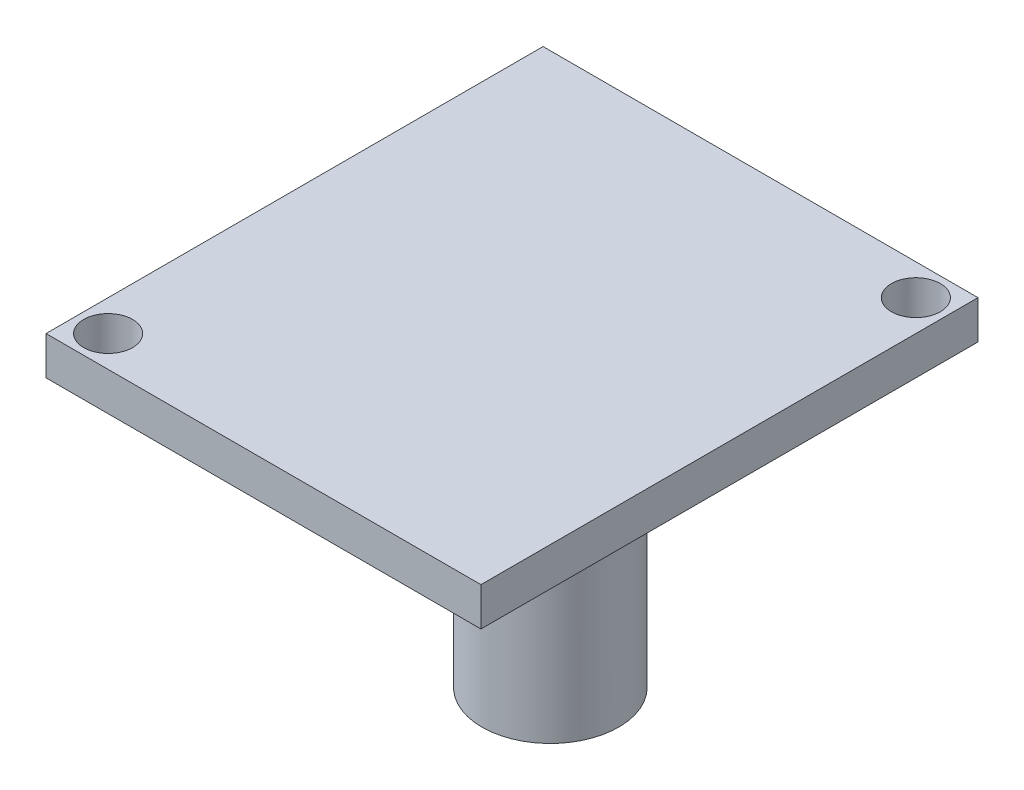
ISO-10303-21;
HEADER;
FILE_DESCRIPTION(('STEP AP214'),'2;1');
FILE_NAME('part.step','',(''),(''),'','','');
FILE_SCHEMA(('AUTOMOTIVE_DESIGN { 1 0 10303 214 1 1 1 1 }'));
ENDSEC;
DATA;
#1=APPLICATION_CONTEXT('core data for automotive mechanical design processes');
#2=APPLICATION_PROTOCOL_DEFINITION('international standard','automotive_design',2000,#1);
#3=PRODUCT_CONTEXT('',#1,'mechanical');
#4=PRODUCT('Part','Part','',(#3));
#5=PRODUCT_RELATED_PRODUCT_CATEGORY('part','',(#4));
#6=PRODUCT_DEFINITION_FORMATION('','',#4);
#7=PRODUCT_DEFINITION_CONTEXT('part definition',#1,'design');
#8=PRODUCT_DEFINITION('design','',#6,#7);
#9=PRODUCT_DEFINITION_SHAPE('','',#8);
#10=(LENGTH_UNIT() NAMED_UNIT(*) SI_UNIT(.MILLI.,.METRE.));
#11=(NAMED_UNIT(*) PLANE_ANGLE_UNIT() SI_UNIT($,.RADIAN.));
#12=(NAMED_UNIT(*) SI_UNIT($,.STERADIAN.) SOLID_ANGLE_UNIT());
#13=UNCERTAINTY_MEASURE_WITH_UNIT(LENGTH_MEASURE(1.E-05),#10,'distance_accuracy_value','');
#14=(GEOMETRIC_REPRESENTATION_CONTEXT(3) GLOBAL_UNCERTAINTY_ASSIGNED_CONTEXT((#13)) GLOBAL_UNIT_ASSIGNED_CONTEXT((#10,
#11,#12)) REPRESENTATION_CONTEXT('',''));
#15=CARTESIAN_POINT('',(0.,0.,0.));
#16=DIRECTION('',(0.,0.,1.));
#17=DIRECTION('',(1.,0.,0.));
#18=AXIS2_PLACEMENT_3D('',#15,#16,#17);
#19=CARTESIAN_POINT('',(8.89,1.57,10.16));
#20=DIRECTION('',(-1.,0.,0.));
#21=DIRECTION('',(0.,0.,1.));
#22=AXIS2_PLACEMENT_3D('',#19,#20,#21);
#23=PLANE('',#22);
#24=DIRECTION('',(0.,0.,-1.));
#25=VECTOR('',#24,1.);
#26=CARTESIAN_POINT('',(8.89,0.,10.16));
#27=LINE('',#26,#25);
#28=CARTESIAN_POINT('',(8.89,0.,10.16));
#29=VERTEX_POINT('',#28);
#30=CARTESIAN_POINT('',(8.89,0.,-10.16));
#31=VERTEX_POINT('',#30);
#32=EDGE_CURVE('E102',#29,#31,#27,.T.);
#33=ORIENTED_EDGE('',*,*,#32,.T.);
#34=DIRECTION('',(0.,-1.,0.));
#35=VECTOR('',#34,1.);
#36=CARTESIAN_POINT('',(8.89,1.57,-10.16));
#37=LINE('',#36,#35);
#38=CARTESIAN_POINT('',(8.89,1.57,-10.16));
#39=VERTEX_POINT('',#38);
#40=EDGE_CURVE('E93',#39,#31,#37,.T.);
#41=ORIENTED_EDGE('',*,*,#40,.F.);
#42=DIRECTION('',(0.,0.,-1.));
#43=VECTOR('',#42,1.);
#44=CARTESIAN_POINT('',(8.89,1.57,10.16));
#45=LINE('',#44,#43);
#46=CARTESIAN_POINT('',(8.89,1.57,10.16));
#47=VERTEX_POINT('',#46);
#48=EDGE_CURVE('E87',#47,#39,#45,.T.);
#49=ORIENTED_EDGE('',*,*,#48,.F.);
#50=DIRECTION('',(0.,-1.,0.));
#51=VECTOR('',#50,1.);
#52=CARTESIAN_POINT('',(8.89,1.57,10.16));
#53=LINE('',#52,#51);
#54=EDGE_CURVE('E98',#47,#29,#53,.T.);
#55=ORIENTED_EDGE('',*,*,#54,.T.);
#56=EDGE_LOOP('',(#33,#41,#49,#55));
#57=FACE_BOUND('',#56,.T.);
#58=ADVANCED_FACE('F33',(#57),#23,.F.);
#59=CARTESIAN_POINT('',(-8.89,1.57,-10.16));
#60=DIRECTION('',(0.,0.,1.));
#61=DIRECTION('',(1.,0.,0.));
#62=AXIS2_PLACEMENT_3D('',#59,#60,#61);
#63=PLANE('',#62);
#64=DIRECTION('',(-1.,0.,0.));
#65=VECTOR('',#64,1.);
#66=CARTESIAN_POINT('',(-8.89,0.,-10.16));
#67=LINE('',#66,#65);
#68=CARTESIAN_POINT('',(-8.89,0.,-10.16));
#69=VERTEX_POINT('',#68);
#70=EDGE_CURVE('E92',#31,#69,#67,.T.);
#71=ORIENTED_EDGE('',*,*,#70,.T.);
#72=DIRECTION('',(0.,-1.,0.));
#73=VECTOR('',#72,1.);
#74=CARTESIAN_POINT('',(-8.89,1.57,-10.16));
#75=LINE('',#74,#73);
#76=CARTESIAN_POINT('',(-8.89,1.57,-10.16));
#77=VERTEX_POINT('',#76);
#78=EDGE_CURVE('E90',#77,#69,#75,.T.);
#79=ORIENTED_EDGE('',*,*,#78,.F.);
#80=DIRECTION('',(-1.,0.,0.));
#81=VECTOR('',#80,1.);
#82=CARTESIAN_POINT('',(-8.89,1.57,-10.16));
#83=LINE('',#82,#81);
#84=EDGE_CURVE('E82',#39,#77,#83,.T.);
#85=ORIENTED_EDGE('',*,*,#84,.F.);
#86=ORIENTED_EDGE('',*,*,#40,.T.);
#87=EDGE_LOOP('',(#71,#79,#85,#86));
#88=FACE_BOUND('',#87,.T.);
#89=ADVANCED_FACE('F91',(#88),#63,.F.);
#90=CARTESIAN_POINT('',(-8.89,1.57,10.16));
#91=DIRECTION('',(1.,0.,0.));
#92=DIRECTION('',(0.,0.,-1.));
#93=AXIS2_PLACEMENT_3D('',#90,#91,#92);
#94=PLANE('',#93);
#95=DIRECTION('',(0.,0.,1.));
#96=VECTOR('',#95,1.);
#97=CARTESIAN_POINT('',(-8.89,0.,10.16));
#98=LINE('',#97,#96);
#99=CARTESIAN_POINT('',(-8.89,0.,10.16));
#100=VERTEX_POINT('',#99);
#101=EDGE_CURVE('E68',#69,#100,#98,.T.);
#102=ORIENTED_EDGE('',*,*,#101,.T.);
#103=DIRECTION('',(0.,-1.,0.));
#104=VECTOR('',#103,1.);
#105=CARTESIAN_POINT('',(-8.89,1.57,10.16));
#106=LINE('',#105,#104);
#107=CARTESIAN_POINT('',(-8.89,1.57,10.16));
#108=VERTEX_POINT('',#107);
#109=EDGE_CURVE('E94',#108,#100,#106,.T.);
#110=ORIENTED_EDGE('',*,*,#109,.F.);
#111=DIRECTION('',(0.,0.,1.));
#112=VECTOR('',#111,1.);
#113=CARTESIAN_POINT('',(-8.89,1.57,10.16));
#114=LINE('',#113,#112);
#115=EDGE_CURVE('E85',#77,#108,#114,.T.);
#116=ORIENTED_EDGE('',*,*,#115,.F.);
#117=ORIENTED_EDGE('',*,*,#78,.T.);
#118=EDGE_LOOP('',(#102,#110,#116,#117));
#119=FACE_BOUND('',#118,.T.);
#120=ADVANCED_FACE('F96',(#119),#94,.F.);
#121=CARTESIAN_POINT('',(-8.89,1.57,10.16));
#122=DIRECTION('',(0.,0.,-1.));
#123=DIRECTION('',(-1.,0.,0.));
#124=AXIS2_PLACEMENT_3D('',#121,#122,#123);
#125=PLANE('',#124);
#126=DIRECTION('',(1.,0.,0.));
#127=VECTOR('',#126,1.);
#128=CARTESIAN_POINT('',(-8.89,0.,10.16));
#129=LINE('',#128,#127);
#130=EDGE_CURVE('E74',#100,#29,#129,.T.);
#131=ORIENTED_EDGE('',*,*,#130,.T.);
#132=ORIENTED_EDGE('',*,*,#54,.F.);
#133=DIRECTION('',(1.,0.,0.));
#134=VECTOR('',#133,1.);
#135=CARTESIAN_POINT('',(-8.89,1.57,10.16));
#136=LINE('',#135,#134);
#137=EDGE_CURVE('E51',#108,#47,#136,.T.);
#138=ORIENTED_EDGE('',*,*,#137,.F.);
#139=ORIENTED_EDGE('',*,*,#109,.T.);
#140=EDGE_LOOP('',(#131,#132,#138,#139));
#141=FACE_BOUND('',#140,.T.);
#142=ADVANCED_FACE('F162',(#141),#125,.F.);
#143=CARTESIAN_POINT('',(0.,1.57,0.));
#144=DIRECTION('',(0.,-1.,0.));
#145=DIRECTION('',(0.,0.,-1.));
#146=AXIS2_PLACEMENT_3D('',#143,#144,#145);
#147=PLANE('',#146);
#148=CARTESIAN_POINT('',(-7.62,1.57,8.89));
#149=DIRECTION('',(0.,1.,0.));
#150=DIRECTION('',(0.,0.,1.));
#151=AXIS2_PLACEMENT_3D('',#148,#149,#150);
#152=CIRCLE('',#151,1.);
#153=CARTESIAN_POINT('',(-7.62,1.57,9.89));
#154=VERTEX_POINT('',#153);
#155=EDGE_CURVE('E115',#154,#154,#152,.T.);
#156=ORIENTED_EDGE('',*,*,#155,.F.);
#157=EDGE_LOOP('',(#156));
#158=FACE_BOUND('',#157,.T.);
#159=CARTESIAN_POINT('',(7.62,1.57,-8.89));
#160=DIRECTION('',(0.,1.,0.));
#161=DIRECTION('',(0.,0.,1.));
#162=AXIS2_PLACEMENT_3D('',#159,#160,#161);
#163=CIRCLE('',#162,0.999999999999999);
#164=CARTESIAN_POINT('',(7.62,1.57,-7.89));
#165=VERTEX_POINT('',#164);
#166=EDGE_CURVE('E121',#165,#165,#163,.T.);
#167=ORIENTED_EDGE('',*,*,#166,.F.);
#168=EDGE_LOOP('',(#167));
#169=FACE_BOUND('',#168,.T.);
#170=ORIENTED_EDGE('',*,*,#48,.T.);
#171=ORIENTED_EDGE('',*,*,#84,.T.);
#172=ORIENTED_EDGE('',*,*,#115,.T.);
#173=ORIENTED_EDGE('',*,*,#137,.T.);
#174=EDGE_LOOP('',(#170,#171,#172,#173));
#175=FACE_BOUND('',#174,.T.);
#176=ADVANCED_FACE('F83',(#158,#169,#175),#147,.F.);
#177=CARTESIAN_POINT('',(0.,0.,0.));
#178=DIRECTION('',(0.,-1.,0.));
#179=DIRECTION('',(0.,0.,-1.));
#180=AXIS2_PLACEMENT_3D('',#177,#178,#179);
#181=PLANE('',#180);
#182=CARTESIAN_POINT('',(-7.62,0.,8.89));
#183=DIRECTION('',(0.,-1.,0.));
#184=DIRECTION('',(0.,0.,-1.));
#185=AXIS2_PLACEMENT_3D('',#182,#183,#184);
#186=CIRCLE('',#185,1.);
#187=CARTESIAN_POINT('',(-7.62,0.,7.89));
#188=VERTEX_POINT('',#187);
#189=EDGE_CURVE('E36',#188,#188,#186,.T.);
#190=ORIENTED_EDGE('',*,*,#189,.F.);
#191=EDGE_LOOP('',(#190));
#192=FACE_BOUND('',#191,.T.);
#193=CARTESIAN_POINT('',(7.62,0.,-8.89));
#194=DIRECTION('',(0.,-1.,0.));
#195=DIRECTION('',(0.,0.,-1.));
#196=AXIS2_PLACEMENT_3D('',#193,#194,#195);
#197=CIRCLE('',#196,0.999999999999999);
#198=CARTESIAN_POINT('',(7.62,0.,-9.89));
#199=VERTEX_POINT('',#198);
#200=EDGE_CURVE('E113',#199,#199,#197,.T.);
#201=ORIENTED_EDGE('',*,*,#200,.F.);
#202=EDGE_LOOP('',(#201));
#203=FACE_BOUND('',#202,.T.);
#204=CARTESIAN_POINT('',(-5.05172503557845,0.,0.));
#205=DIRECTION('',(0.,-1.,0.));
#206=DIRECTION('',(0.,0.,-1.));
#207=AXIS2_PLACEMENT_3D('',#204,#205,#206);
#208=CIRCLE('',#207,2.79787848124345);
#209=CARTESIAN_POINT('',(-5.05172503557845,0.,-2.79787848124345));
#210=VERTEX_POINT('',#209);
#211=EDGE_CURVE('E11',#210,#210,#208,.T.);
#212=ORIENTED_EDGE('',*,*,#211,.F.);
#213=EDGE_LOOP('',(#212));
#214=FACE_BOUND('',#213,.T.);
#215=CARTESIAN_POINT('',(5.15535016451339,0.,3.58802008937238));
#216=DIRECTION('',(0.,-1.,0.));
#217=DIRECTION('',(0.,0.,-1.));
#218=AXIS2_PLACEMENT_3D('',#215,#216,#217);
#219=CIRCLE('',#218,2.79787848124345);
#220=CARTESIAN_POINT('',(5.15535016451339,0.,0.790141608128929));
#221=VERTEX_POINT('',#220);
#222=EDGE_CURVE('E42',#221,#221,#219,.T.);
#223=ORIENTED_EDGE('',*,*,#222,.F.);
#224=EDGE_LOOP('',(#223));
#225=FACE_BOUND('',#224,.T.);
#226=ORIENTED_EDGE('',*,*,#32,.F.);
#227=ORIENTED_EDGE('',*,*,#130,.F.);
#228=ORIENTED_EDGE('',*,*,#101,.F.);
#229=ORIENTED_EDGE('',*,*,#70,.F.);
#230=EDGE_LOOP('',(#226,#227,#228,#229));
#231=FACE_BOUND('',#230,.T.);
#232=ADVANCED_FACE('F146',(#192,#203,#214,#225,#231),#181,.T.);
#233=CARTESIAN_POINT('',(5.15535016451339,-7.23,3.58802008937238));
#234=DIRECTION('',(0.,1.,0.));
#235=DIRECTION('',(0.,0.,1.));
#236=AXIS2_PLACEMENT_3D('',#233,#234,#235);
#237=CYLINDRICAL_SURFACE('',#236,2.79787848124345);
#238=ORIENTED_EDGE('',*,*,#222,.T.);
#239=EDGE_LOOP('',(#238));
#240=FACE_BOUND('',#239,.T.);
#241=CARTESIAN_POINT('',(5.15535016451339,-7.23,3.58802008937238));
#242=DIRECTION('',(0.,1.,0.));
#243=DIRECTION('',(0.,0.,1.));
#244=AXIS2_PLACEMENT_3D('',#241,#242,#243);
#245=CIRCLE('',#244,2.79787848124345);
#246=CARTESIAN_POINT('',(5.15535016451339,-7.23,6.38589857061583));
#247=VERTEX_POINT('',#246);
#248=EDGE_CURVE('E105',#247,#247,#245,.T.);
#249=ORIENTED_EDGE('',*,*,#248,.T.);
#250=EDGE_LOOP('',(#249));
#251=FACE_BOUND('',#250,.T.);
#252=ADVANCED_FACE('F133',(#240,#251),#237,.T.);
#253=CARTESIAN_POINT('',(5.15535016451339,-7.23,3.58802008937238));
#254=DIRECTION('',(0.,1.,0.));
#255=DIRECTION('',(0.,0.,1.));
#256=AXIS2_PLACEMENT_3D('',#253,#254,#255);
#257=PLANE('',#256);
#258=ORIENTED_EDGE('',*,*,#248,.F.);
#259=EDGE_LOOP('',(#258));
#260=FACE_BOUND('',#259,.T.);
#261=ADVANCED_FACE('F135',(#260),#257,.F.);
#262=CARTESIAN_POINT('',(-5.05172503557845,-7.23,0.));
#263=DIRECTION('',(0.,1.,0.));
#264=DIRECTION('',(0.,0.,1.));
#265=AXIS2_PLACEMENT_3D('',#262,#263,#264);
#266=CYLINDRICAL_SURFACE('',#265,2.79787848124345);
#267=ORIENTED_EDGE('',*,*,#211,.T.);
#268=EDGE_LOOP('',(#267));
#269=FACE_BOUND('',#268,.T.);
#270=CARTESIAN_POINT('',(-5.05172503557845,-7.23,0.));
#271=DIRECTION('',(0.,1.,0.));
#272=DIRECTION('',(0.,0.,1.));
#273=AXIS2_PLACEMENT_3D('',#270,#271,#272);
#274=CIRCLE('',#273,2.79787848124345);
#275=CARTESIAN_POINT('',(-5.05172503557845,-7.23,2.79787848124345));
#276=VERTEX_POINT('',#275);
#277=EDGE_CURVE('E119',#276,#276,#274,.T.);
#278=ORIENTED_EDGE('',*,*,#277,.T.);
#279=EDGE_LOOP('',(#278));
#280=FACE_BOUND('',#279,.T.);
#281=ADVANCED_FACE('F137',(#269,#280),#266,.T.);
#282=CARTESIAN_POINT('',(-5.05172503557845,-7.23,0.));
#283=DIRECTION('',(0.,1.,0.));
#284=DIRECTION('',(0.,0.,1.));
#285=AXIS2_PLACEMENT_3D('',#282,#283,#284);
#286=PLANE('',#285);
#287=ORIENTED_EDGE('',*,*,#277,.F.);
#288=EDGE_LOOP('',(#287));
#289=FACE_BOUND('',#288,.T.);
#290=ADVANCED_FACE('F143',(#289),#286,.F.);
#291=CARTESIAN_POINT('',(7.62,-7.23,-8.89));
#292=DIRECTION('',(0.,1.,0.));
#293=DIRECTION('',(0.,0.,1.));
#294=AXIS2_PLACEMENT_3D('',#291,#292,#293);
#295=CYLINDRICAL_SURFACE('',#294,0.999999999999999);
#296=ORIENTED_EDGE('',*,*,#200,.T.);
#297=EDGE_LOOP('',(#296));
#298=FACE_BOUND('',#297,.T.);
#299=ORIENTED_EDGE('',*,*,#166,.T.);
#300=EDGE_LOOP('',(#299));
#301=FACE_BOUND('',#300,.T.);
#302=ADVANCED_FACE('F199',(#298,#301),#295,.F.);
#303=CARTESIAN_POINT('',(-7.62,-7.23,8.89));
#304=DIRECTION('',(0.,1.,0.));
#305=DIRECTION('',(0.,0.,1.));
#306=AXIS2_PLACEMENT_3D('',#303,#304,#305);
#307=CYLINDRICAL_SURFACE('',#306,1.);
#308=ORIENTED_EDGE('',*,*,#189,.T.);
#309=EDGE_LOOP('',(#308));
#310=FACE_BOUND('',#309,.T.);
#311=ORIENTED_EDGE('',*,*,#155,.T.);
#312=EDGE_LOOP('',(#311));
#313=FACE_BOUND('',#312,.T.);
#314=ADVANCED_FACE('F204',(#310,#313),#307,.F.);
#315=CLOSED_SHELL('',(#58,#89,#120,#142,#176,#232,#252,#261,#281,#290,#302,#314));
#316=MANIFOLD_SOLID_BREP('B2',#315);
#317=ADVANCED_BREP_SHAPE_REPRESENTATION('',(#18,#316),#14);
#318=SHAPE_DEFINITION_REPRESENTATION(#9,#317);
ENDSEC;
END-ISO-10303-21;
